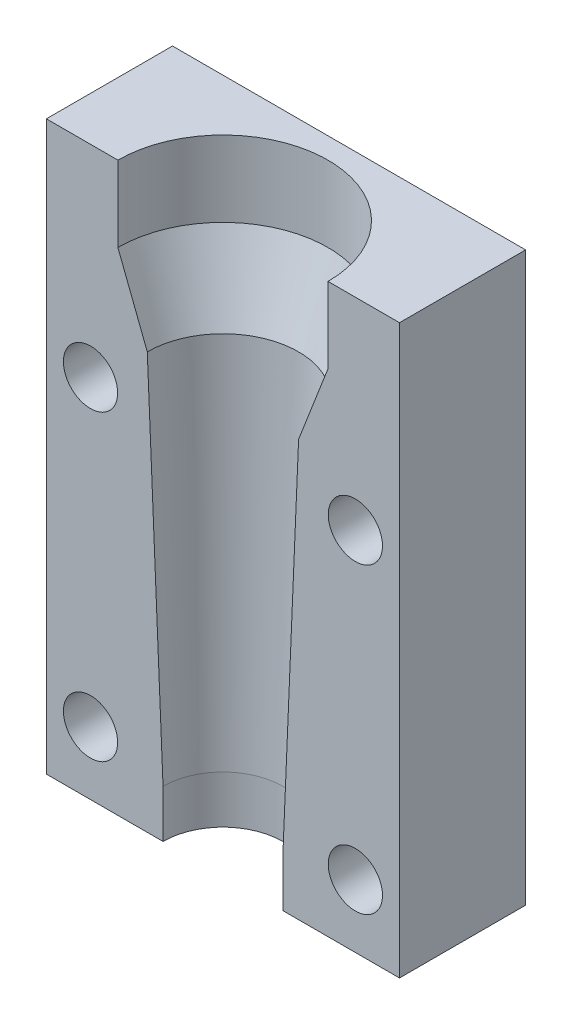
ISO-10303-21;
HEADER;
FILE_DESCRIPTION(('STEP AP214'),'2;1');
FILE_NAME('part.step','',(''),(''),'','','');
FILE_SCHEMA(('AUTOMOTIVE_DESIGN { 1 0 10303 214 1 1 1 1 }'));
ENDSEC;
DATA;
#1=APPLICATION_CONTEXT('core data for automotive mechanical design processes');
#2=APPLICATION_PROTOCOL_DEFINITION('international standard','automotive_design',2000,#1);
#3=PRODUCT_CONTEXT('',#1,'mechanical');
#4=PRODUCT('Part','Part','',(#3));
#5=PRODUCT_RELATED_PRODUCT_CATEGORY('part','',(#4));
#6=PRODUCT_DEFINITION_FORMATION('','',#4);
#7=PRODUCT_DEFINITION_CONTEXT('part definition',#1,'design');
#8=PRODUCT_DEFINITION('design','',#6,#7);
#9=PRODUCT_DEFINITION_SHAPE('','',#8);
#10=(LENGTH_UNIT() NAMED_UNIT(*) SI_UNIT(.MILLI.,.METRE.));
#11=(NAMED_UNIT(*) PLANE_ANGLE_UNIT() SI_UNIT($,.RADIAN.));
#12=(NAMED_UNIT(*) SI_UNIT($,.STERADIAN.) SOLID_ANGLE_UNIT());
#13=UNCERTAINTY_MEASURE_WITH_UNIT(LENGTH_MEASURE(1.E-05),#10,'distance_accuracy_value','');
#14=(GEOMETRIC_REPRESENTATION_CONTEXT(3) GLOBAL_UNCERTAINTY_ASSIGNED_CONTEXT((#13)) GLOBAL_UNIT_ASSIGNED_CONTEXT((#10,
#11,#12)) REPRESENTATION_CONTEXT('',''));
#15=CARTESIAN_POINT('',(0.,0.,0.));
#16=DIRECTION('',(0.,0.,1.));
#17=DIRECTION('',(1.,0.,0.));
#18=AXIS2_PLACEMENT_3D('',#15,#16,#17);
#19=CARTESIAN_POINT('',(0.,0.,10.));
#20=DIRECTION('',(0.,0.,1.));
#21=DIRECTION('',(1.,0.,0.));
#22=AXIS2_PLACEMENT_3D('',#19,#20,#21);
#23=PLANE('',#22);
#24=CARTESIAN_POINT('',(-10.5,-17.5,10.));
#25=DIRECTION('',(0.,0.,1.));
#26=DIRECTION('',(1.,0.,0.));
#27=AXIS2_PLACEMENT_3D('',#24,#25,#26);
#28=CIRCLE('',#27,2.15);
#29=CARTESIAN_POINT('',(-8.35,-17.5,10.));
#30=VERTEX_POINT('',#29);
#31=EDGE_CURVE('E219',#30,#30,#28,.T.);
#32=ORIENTED_EDGE('',*,*,#31,.F.);
#33=EDGE_LOOP('',(#32));
#34=FACE_BOUND('',#33,.T.);
#35=CARTESIAN_POINT('',(-10.5,6.5,10.));
#36=DIRECTION('',(0.,0.,1.));
#37=DIRECTION('',(1.,0.,0.));
#38=AXIS2_PLACEMENT_3D('',#35,#36,#37);
#39=CIRCLE('',#38,2.15);
#40=CARTESIAN_POINT('',(-8.35,6.5,10.));
#41=VERTEX_POINT('',#40);
#42=EDGE_CURVE('E222',#41,#41,#39,.T.);
#43=ORIENTED_EDGE('',*,*,#42,.F.);
#44=EDGE_LOOP('',(#43));
#45=FACE_BOUND('',#44,.T.);
#46=DIRECTION('',(0.,-1.,0.));
#47=VECTOR('',#46,1.);
#48=CARTESIAN_POINT('',(-8.33,0.,10.));
#49=LINE('',#48,#47);
#50=CARTESIAN_POINT('',(-8.33,22.5,10.));
#51=VERTEX_POINT('',#50);
#52=CARTESIAN_POINT('',(-8.33,16.5,10.));
#53=VERTEX_POINT('',#52);
#54=EDGE_CURVE('E11',#51,#53,#49,.T.);
#55=ORIENTED_EDGE('',*,*,#54,.F.);
#56=DIRECTION('',(-1.,0.,0.));
#57=VECTOR('',#56,1.);
#58=CARTESIAN_POINT('',(-14.,22.5,10.));
#59=LINE('',#58,#57);
#60=CARTESIAN_POINT('',(-14.,22.5,10.));
#61=VERTEX_POINT('',#60);
#62=EDGE_CURVE('E182',#51,#61,#59,.T.);
#63=ORIENTED_EDGE('',*,*,#62,.T.);
#64=DIRECTION('',(0.,-1.,0.));
#65=VECTOR('',#64,1.);
#66=CARTESIAN_POINT('',(-14.,22.5,10.));
#67=LINE('',#66,#65);
#68=CARTESIAN_POINT('',(-14.,-22.5,10.));
#69=VERTEX_POINT('',#68);
#70=EDGE_CURVE('E132',#61,#69,#67,.T.);
#71=ORIENTED_EDGE('',*,*,#70,.T.);
#72=DIRECTION('',(1.,0.,0.));
#73=VECTOR('',#72,1.);
#74=CARTESIAN_POINT('',(-14.,-22.5,10.));
#75=LINE('',#74,#73);
#76=CARTESIAN_POINT('',(-4.75,-22.5,10.));
#77=VERTEX_POINT('',#76);
#78=EDGE_CURVE('E127',#69,#77,#75,.T.);
#79=ORIENTED_EDGE('',*,*,#78,.T.);
#80=DIRECTION('',(0.,-1.,0.));
#81=VECTOR('',#80,1.);
#82=CARTESIAN_POINT('',(-4.75,0.,10.));
#83=LINE('',#82,#81);
#84=CARTESIAN_POINT('',(-4.75,-18.71,10.));
#85=VERTEX_POINT('',#84);
#86=EDGE_CURVE('E115',#85,#77,#83,.T.);
#87=ORIENTED_EDGE('',*,*,#86,.F.);
#88=DIRECTION('',(0.0427544338898444,-0.999085611137884,0.));
#89=VECTOR('',#88,1.);
#90=CARTESIAN_POINT('',(0.,-129.708,10.));
#91=LINE('',#90,#89);
#92=CARTESIAN_POINT('',(-6.,10.5,10.));
#93=VERTEX_POINT('',#92);
#94=EDGE_CURVE('E122',#93,#85,#91,.T.);
#95=ORIENTED_EDGE('',*,*,#94,.F.);
#96=DIRECTION('',(0.361996373599852,-0.932179502832237,0.));
#97=VECTOR('',#96,1.);
#98=CARTESIAN_POINT('',(0.,-4.95064377682404,10.));
#99=LINE('',#98,#97);
#100=EDGE_CURVE('E43',#53,#93,#99,.T.);
#101=ORIENTED_EDGE('',*,*,#100,.F.);
#102=EDGE_LOOP('',(#55,#63,#71,#79,#87,#95,#101));
#103=FACE_BOUND('',#102,.T.);
#104=ADVANCED_FACE('F35',(#34,#45,#103),#23,.T.);
#105=CARTESIAN_POINT('',(14.,22.5,10.));
#106=DIRECTION('',(-1.,0.,0.));
#107=DIRECTION('',(0.,-1.,0.));
#108=AXIS2_PLACEMENT_3D('',#105,#106,#107);
#109=PLANE('',#108);
#110=DIRECTION('',(0.,1.,0.));
#111=VECTOR('',#110,1.);
#112=CARTESIAN_POINT('',(14.,22.5,0.));
#113=LINE('',#112,#111);
#114=CARTESIAN_POINT('',(14.,-22.5,0.));
#115=VERTEX_POINT('',#114);
#116=CARTESIAN_POINT('',(14.,22.5,0.));
#117=VERTEX_POINT('',#116);
#118=EDGE_CURVE('E141',#115,#117,#113,.T.);
#119=ORIENTED_EDGE('',*,*,#118,.T.);
#120=DIRECTION('',(0.,0.,-1.));
#121=VECTOR('',#120,1.);
#122=CARTESIAN_POINT('',(14.,22.5,10.));
#123=LINE('',#122,#121);
#124=CARTESIAN_POINT('',(14.,22.5,10.));
#125=VERTEX_POINT('',#124);
#126=EDGE_CURVE('E155',#125,#117,#123,.T.);
#127=ORIENTED_EDGE('',*,*,#126,.F.);
#128=DIRECTION('',(0.,1.,0.));
#129=VECTOR('',#128,1.);
#130=CARTESIAN_POINT('',(14.,22.5,10.));
#131=LINE('',#130,#129);
#132=CARTESIAN_POINT('',(14.,-22.5,10.));
#133=VERTEX_POINT('',#132);
#134=EDGE_CURVE('E149',#133,#125,#131,.T.);
#135=ORIENTED_EDGE('',*,*,#134,.F.);
#136=DIRECTION('',(0.,0.,-1.));
#137=VECTOR('',#136,1.);
#138=CARTESIAN_POINT('',(14.,-22.5,10.));
#139=LINE('',#138,#137);
#140=EDGE_CURVE('E134',#133,#115,#139,.T.);
#141=ORIENTED_EDGE('',*,*,#140,.T.);
#142=EDGE_LOOP('',(#119,#127,#135,#141));
#143=FACE_BOUND('',#142,.T.);
#144=ADVANCED_FACE('F37',(#143),#109,.F.);
#145=CARTESIAN_POINT('',(-14.,22.5,10.));
#146=DIRECTION('',(0.,-1.,0.));
#147=DIRECTION('',(0.,0.,-1.));
#148=AXIS2_PLACEMENT_3D('',#145,#146,#147);
#149=PLANE('',#148);
#150=ORIENTED_EDGE('',*,*,#62,.F.);
#151=CARTESIAN_POINT('',(0.,22.5,10.));
#152=DIRECTION('',(0.,-1.,0.));
#153=DIRECTION('',(0.,0.,-1.));
#154=AXIS2_PLACEMENT_3D('',#151,#152,#153);
#155=CIRCLE('',#154,8.33);
#156=CARTESIAN_POINT('',(8.33,22.5,10.));
#157=VERTEX_POINT('',#156);
#158=EDGE_CURVE('E145',#51,#157,#155,.T.);
#159=ORIENTED_EDGE('',*,*,#158,.T.);
#160=EDGE_CURVE('E88',#125,#157,#59,.T.);
#161=ORIENTED_EDGE('',*,*,#160,.F.);
#162=ORIENTED_EDGE('',*,*,#126,.T.);
#163=DIRECTION('',(-1.,0.,0.));
#164=VECTOR('',#163,1.);
#165=CARTESIAN_POINT('',(-14.,22.5,0.));
#166=LINE('',#165,#164);
#167=CARTESIAN_POINT('',(-14.,22.5,0.));
#168=VERTEX_POINT('',#167);
#169=EDGE_CURVE('E144',#117,#168,#166,.T.);
#170=ORIENTED_EDGE('',*,*,#169,.T.);
#171=DIRECTION('',(0.,0.,-1.));
#172=VECTOR('',#171,1.);
#173=CARTESIAN_POINT('',(-14.,22.5,10.));
#174=LINE('',#173,#172);
#175=EDGE_CURVE('E152',#61,#168,#174,.T.);
#176=ORIENTED_EDGE('',*,*,#175,.F.);
#177=EDGE_LOOP('',(#150,#159,#161,#162,#170,#176));
#178=FACE_BOUND('',#177,.T.);
#179=ADVANCED_FACE('F186',(#178),#149,.F.);
#180=CARTESIAN_POINT('',(-14.,22.5,10.));
#181=DIRECTION('',(1.,0.,0.));
#182=DIRECTION('',(0.,1.,0.));
#183=AXIS2_PLACEMENT_3D('',#180,#181,#182);
#184=PLANE('',#183);
#185=DIRECTION('',(0.,-1.,0.));
#186=VECTOR('',#185,1.);
#187=CARTESIAN_POINT('',(-14.,22.5,0.));
#188=LINE('',#187,#186);
#189=CARTESIAN_POINT('',(-14.,-22.5,0.));
#190=VERTEX_POINT('',#189);
#191=EDGE_CURVE('E147',#168,#190,#188,.T.);
#192=ORIENTED_EDGE('',*,*,#191,.T.);
#193=DIRECTION('',(0.,0.,-1.));
#194=VECTOR('',#193,1.);
#195=CARTESIAN_POINT('',(-14.,-22.5,10.));
#196=LINE('',#195,#194);
#197=EDGE_CURVE('E136',#69,#190,#196,.T.);
#198=ORIENTED_EDGE('',*,*,#197,.F.);
#199=ORIENTED_EDGE('',*,*,#70,.F.);
#200=ORIENTED_EDGE('',*,*,#175,.T.);
#201=EDGE_LOOP('',(#192,#198,#199,#200));
#202=FACE_BOUND('',#201,.T.);
#203=ADVANCED_FACE('F189',(#202),#184,.F.);
#204=CARTESIAN_POINT('',(-14.,-22.5,10.));
#205=DIRECTION('',(0.,1.,0.));
#206=DIRECTION('',(0.,0.,1.));
#207=AXIS2_PLACEMENT_3D('',#204,#205,#206);
#208=PLANE('',#207);
#209=CARTESIAN_POINT('',(4.75,-22.5,10.));
#210=VERTEX_POINT('',#209);
#211=EDGE_CURVE('E58',#210,#133,#75,.T.);
#212=ORIENTED_EDGE('',*,*,#211,.F.);
#213=CARTESIAN_POINT('',(0.,-22.5,10.));
#214=DIRECTION('',(0.,-1.,0.));
#215=DIRECTION('',(0.,0.,-1.));
#216=AXIS2_PLACEMENT_3D('',#213,#214,#215);
#217=CIRCLE('',#216,4.75);
#218=EDGE_CURVE('E50',#77,#210,#217,.T.);
#219=ORIENTED_EDGE('',*,*,#218,.F.);
#220=ORIENTED_EDGE('',*,*,#78,.F.);
#221=ORIENTED_EDGE('',*,*,#197,.T.);
#222=DIRECTION('',(1.,0.,0.));
#223=VECTOR('',#222,1.);
#224=CARTESIAN_POINT('',(-14.,-22.5,0.));
#225=LINE('',#224,#223);
#226=EDGE_CURVE('E80',#190,#115,#225,.T.);
#227=ORIENTED_EDGE('',*,*,#226,.T.);
#228=ORIENTED_EDGE('',*,*,#140,.F.);
#229=EDGE_LOOP('',(#212,#219,#220,#221,#227,#228));
#230=FACE_BOUND('',#229,.T.);
#231=ADVANCED_FACE('F126',(#230),#208,.F.);
#232=CARTESIAN_POINT('',(10.5,6.5,10.));
#233=DIRECTION('',(0.,0.,1.));
#234=DIRECTION('',(1.,0.,0.));
#235=AXIS2_PLACEMENT_3D('',#232,#233,#234);
#236=CIRCLE('',#235,2.15);
#237=CARTESIAN_POINT('',(12.65,6.5,10.));
#238=VERTEX_POINT('',#237);
#239=EDGE_CURVE('E231',#238,#238,#236,.T.);
#240=ORIENTED_EDGE('',*,*,#239,.F.);
#241=EDGE_LOOP('',(#240));
#242=FACE_BOUND('',#241,.T.);
#243=CARTESIAN_POINT('',(10.5,-17.5,10.));
#244=DIRECTION('',(0.,0.,1.));
#245=DIRECTION('',(1.,0.,0.));
#246=AXIS2_PLACEMENT_3D('',#243,#244,#245);
#247=CIRCLE('',#246,2.15);
#248=CARTESIAN_POINT('',(12.65,-17.5,10.));
#249=VERTEX_POINT('',#248);
#250=EDGE_CURVE('E239',#249,#249,#247,.T.);
#251=ORIENTED_EDGE('',*,*,#250,.F.);
#252=EDGE_LOOP('',(#251));
#253=FACE_BOUND('',#252,.T.);
#254=DIRECTION('',(0.,-1.,0.));
#255=VECTOR('',#254,1.);
#256=CARTESIAN_POINT('',(8.33,0.,10.));
#257=LINE('',#256,#255);
#258=CARTESIAN_POINT('',(8.33,16.5,10.));
#259=VERTEX_POINT('',#258);
#260=EDGE_CURVE('E123',#259,#157,#257,.F.);
#261=ORIENTED_EDGE('',*,*,#260,.F.);
#262=DIRECTION('',(0.361996373599852,0.932179502832237,0.));
#263=VECTOR('',#262,1.);
#264=CARTESIAN_POINT('',(0.,-4.95064377682404,10.));
#265=LINE('',#264,#263);
#266=CARTESIAN_POINT('',(6.,10.5,10.));
#267=VERTEX_POINT('',#266);
#268=EDGE_CURVE('E161',#267,#259,#265,.T.);
#269=ORIENTED_EDGE('',*,*,#268,.F.);
#270=DIRECTION('',(0.0427544338898444,0.999085611137884,0.));
#271=VECTOR('',#270,1.);
#272=CARTESIAN_POINT('',(0.,-129.708,10.));
#273=LINE('',#272,#271);
#274=CARTESIAN_POINT('',(4.75,-18.71,10.));
#275=VERTEX_POINT('',#274);
#276=EDGE_CURVE('E159',#275,#267,#273,.T.);
#277=ORIENTED_EDGE('',*,*,#276,.F.);
#278=DIRECTION('',(0.,-1.,0.));
#279=VECTOR('',#278,1.);
#280=CARTESIAN_POINT('',(4.75,0.,10.));
#281=LINE('',#280,#279);
#282=EDGE_CURVE('E157',#210,#275,#281,.F.);
#283=ORIENTED_EDGE('',*,*,#282,.F.);
#284=ORIENTED_EDGE('',*,*,#211,.T.);
#285=ORIENTED_EDGE('',*,*,#134,.T.);
#286=ORIENTED_EDGE('',*,*,#160,.T.);
#287=EDGE_LOOP('',(#261,#269,#277,#283,#284,#285,#286));
#288=FACE_BOUND('',#287,.T.);
#289=ADVANCED_FACE('F196',(#242,#253,#288),#23,.T.);
#290=CARTESIAN_POINT('',(0.,0.,0.));
#291=DIRECTION('',(0.,0.,1.));
#292=DIRECTION('',(1.,0.,0.));
#293=AXIS2_PLACEMENT_3D('',#290,#291,#292);
#294=PLANE('',#293);
#295=CARTESIAN_POINT('',(10.,12.5,0.));
#296=DIRECTION('',(0.,0.,-1.));
#297=DIRECTION('',(-1.,0.,0.));
#298=AXIS2_PLACEMENT_3D('',#295,#296,#297);
#299=CIRCLE('',#298,2.75);
#300=CARTESIAN_POINT('',(7.25,12.5,0.));
#301=VERTEX_POINT('',#300);
#302=EDGE_CURVE('E251',#301,#301,#299,.T.);
#303=ORIENTED_EDGE('',*,*,#302,.F.);
#304=EDGE_LOOP('',(#303));
#305=FACE_BOUND('',#304,.T.);
#306=CARTESIAN_POINT('',(-10.,12.5,0.));
#307=DIRECTION('',(0.,0.,-1.));
#308=DIRECTION('',(-1.,0.,0.));
#309=AXIS2_PLACEMENT_3D('',#306,#307,#308);
#310=CIRCLE('',#309,2.75);
#311=CARTESIAN_POINT('',(-12.75,12.5,0.));
#312=VERTEX_POINT('',#311);
#313=EDGE_CURVE('E245',#312,#312,#310,.T.);
#314=ORIENTED_EDGE('',*,*,#313,.F.);
#315=EDGE_LOOP('',(#314));
#316=FACE_BOUND('',#315,.T.);
#317=ORIENTED_EDGE('',*,*,#118,.F.);
#318=ORIENTED_EDGE('',*,*,#226,.F.);
#319=ORIENTED_EDGE('',*,*,#191,.F.);
#320=ORIENTED_EDGE('',*,*,#169,.F.);
#321=EDGE_LOOP('',(#317,#318,#319,#320));
#322=FACE_BOUND('',#321,.T.);
#323=ADVANCED_FACE('F192',(#305,#316,#322),#294,.F.);
#324=CARTESIAN_POINT('',(0.,0.,10.));
#325=DIRECTION('',(0.,-1.,0.));
#326=DIRECTION('',(0.,0.,-1.));
#327=AXIS2_PLACEMENT_3D('',#324,#325,#326);
#328=CYLINDRICAL_SURFACE('',#327,8.33);
#329=ORIENTED_EDGE('',*,*,#54,.T.);
#330=CARTESIAN_POINT('',(0.,16.5,10.));
#331=DIRECTION('',(0.,-1.,0.));
#332=DIRECTION('',(0.,0.,-1.));
#333=AXIS2_PLACEMENT_3D('',#330,#331,#332);
#334=CIRCLE('',#333,8.33);
#335=EDGE_CURVE('E173',#53,#259,#334,.T.);
#336=ORIENTED_EDGE('',*,*,#335,.T.);
#337=ORIENTED_EDGE('',*,*,#260,.T.);
#338=ORIENTED_EDGE('',*,*,#158,.F.);
#339=EDGE_LOOP('',(#329,#336,#337,#338));
#340=FACE_BOUND('',#339,.T.);
#341=ADVANCED_FACE('F204',(#340),#328,.F.);
#342=CARTESIAN_POINT('',(0.,10.5,10.));
#343=DIRECTION('',(0.,1.,0.));
#344=DIRECTION('',(0.,0.,1.));
#345=AXIS2_PLACEMENT_3D('',#342,#343,#344);
#346=CONICAL_SURFACE('',#345,6.,0.370408624543169);
#347=ORIENTED_EDGE('',*,*,#268,.T.);
#348=ORIENTED_EDGE('',*,*,#335,.F.);
#349=ORIENTED_EDGE('',*,*,#100,.T.);
#350=CARTESIAN_POINT('',(0.,10.5,10.));
#351=DIRECTION('',(0.,-1.,0.));
#352=DIRECTION('',(0.,0.,-1.));
#353=AXIS2_PLACEMENT_3D('',#350,#351,#352);
#354=CIRCLE('',#353,6.);
#355=EDGE_CURVE('E170',#93,#267,#354,.T.);
#356=ORIENTED_EDGE('',*,*,#355,.T.);
#357=EDGE_LOOP('',(#347,#348,#349,#356));
#358=FACE_BOUND('',#357,.T.);
#359=ADVANCED_FACE('F169',(#358),#346,.F.);
#360=CARTESIAN_POINT('',(0.,-18.71,10.));
#361=DIRECTION('',(0.,1.,0.));
#362=DIRECTION('',(0.,0.,1.));
#363=AXIS2_PLACEMENT_3D('',#360,#361,#362);
#364=CONICAL_SURFACE('',#363,4.75,0.0427674700507354);
#365=ORIENTED_EDGE('',*,*,#276,.T.);
#366=ORIENTED_EDGE('',*,*,#355,.F.);
#367=ORIENTED_EDGE('',*,*,#94,.T.);
#368=CARTESIAN_POINT('',(0.,-18.71,10.));
#369=DIRECTION('',(0.,-1.,0.));
#370=DIRECTION('',(0.,0.,-1.));
#371=AXIS2_PLACEMENT_3D('',#368,#369,#370);
#372=CIRCLE('',#371,4.75);
#373=EDGE_CURVE('E118',#85,#275,#372,.T.);
#374=ORIENTED_EDGE('',*,*,#373,.T.);
#375=EDGE_LOOP('',(#365,#366,#367,#374));
#376=FACE_BOUND('',#375,.T.);
#377=ADVANCED_FACE('F175',(#376),#364,.F.);
#378=CARTESIAN_POINT('',(0.,0.,10.));
#379=DIRECTION('',(0.,-1.,0.));
#380=DIRECTION('',(0.,0.,-1.));
#381=AXIS2_PLACEMENT_3D('',#378,#379,#380);
#382=CYLINDRICAL_SURFACE('',#381,4.75);
#383=ORIENTED_EDGE('',*,*,#86,.T.);
#384=ORIENTED_EDGE('',*,*,#218,.T.);
#385=ORIENTED_EDGE('',*,*,#282,.T.);
#386=ORIENTED_EDGE('',*,*,#373,.F.);
#387=EDGE_LOOP('',(#383,#384,#385,#386));
#388=FACE_BOUND('',#387,.T.);
#389=ADVANCED_FACE('F116',(#388),#382,.F.);
#390=CARTESIAN_POINT('',(10.5,-17.5,4.));
#391=DIRECTION('',(0.,0.,1.));
#392=DIRECTION('',(1.,0.,0.));
#393=AXIS2_PLACEMENT_3D('',#390,#391,#392);
#394=CYLINDRICAL_SURFACE('',#393,2.15);
#395=CARTESIAN_POINT('',(10.5,-17.5,4.));
#396=DIRECTION('',(0.,0.,1.));
#397=DIRECTION('',(1.,0.,0.));
#398=AXIS2_PLACEMENT_3D('',#395,#396,#397);
#399=CIRCLE('',#398,2.15);
#400=CARTESIAN_POINT('',(12.65,-17.5,4.));
#401=VERTEX_POINT('',#400);
#402=EDGE_CURVE('E235',#401,#401,#399,.T.);
#403=ORIENTED_EDGE('',*,*,#402,.F.);
#404=EDGE_LOOP('',(#403));
#405=FACE_BOUND('',#404,.T.);
#406=ORIENTED_EDGE('',*,*,#250,.T.);
#407=EDGE_LOOP('',(#406));
#408=FACE_BOUND('',#407,.T.);
#409=ADVANCED_FACE('F288',(#405,#408),#394,.F.);
#410=CARTESIAN_POINT('',(10.5,-17.5,4.));
#411=DIRECTION('',(0.,0.,1.));
#412=DIRECTION('',(1.,0.,0.));
#413=AXIS2_PLACEMENT_3D('',#410,#411,#412);
#414=PLANE('',#413);
#415=ORIENTED_EDGE('',*,*,#402,.T.);
#416=EDGE_LOOP('',(#415));
#417=FACE_BOUND('',#416,.T.);
#418=ADVANCED_FACE('F284',(#417),#414,.T.);
#419=CARTESIAN_POINT('',(10.5,6.5,4.));
#420=DIRECTION('',(0.,0.,1.));
#421=DIRECTION('',(1.,0.,0.));
#422=AXIS2_PLACEMENT_3D('',#419,#420,#421);
#423=CYLINDRICAL_SURFACE('',#422,2.15);
#424=CARTESIAN_POINT('',(10.5,6.5,4.));
#425=DIRECTION('',(0.,0.,1.));
#426=DIRECTION('',(1.,0.,0.));
#427=AXIS2_PLACEMENT_3D('',#424,#425,#426);
#428=CIRCLE('',#427,2.15);
#429=CARTESIAN_POINT('',(12.65,6.5,4.));
#430=VERTEX_POINT('',#429);
#431=EDGE_CURVE('E234',#430,#430,#428,.T.);
#432=ORIENTED_EDGE('',*,*,#431,.F.);
#433=EDGE_LOOP('',(#432));
#434=FACE_BOUND('',#433,.T.);
#435=ORIENTED_EDGE('',*,*,#239,.T.);
#436=EDGE_LOOP('',(#435));
#437=FACE_BOUND('',#436,.T.);
#438=ADVANCED_FACE('F287',(#434,#437),#423,.F.);
#439=CARTESIAN_POINT('',(10.5,6.5,4.));
#440=DIRECTION('',(0.,0.,1.));
#441=DIRECTION('',(1.,0.,0.));
#442=AXIS2_PLACEMENT_3D('',#439,#440,#441);
#443=PLANE('',#442);
#444=ORIENTED_EDGE('',*,*,#431,.T.);
#445=EDGE_LOOP('',(#444));
#446=FACE_BOUND('',#445,.T.);
#447=ADVANCED_FACE('F297',(#446),#443,.T.);
#448=CARTESIAN_POINT('',(-10.5,6.5,4.));
#449=DIRECTION('',(0.,0.,1.));
#450=DIRECTION('',(1.,0.,0.));
#451=AXIS2_PLACEMENT_3D('',#448,#449,#450);
#452=CYLINDRICAL_SURFACE('',#451,2.15);
#453=CARTESIAN_POINT('',(-10.5,6.5,4.));
#454=DIRECTION('',(0.,0.,1.));
#455=DIRECTION('',(1.,0.,0.));
#456=AXIS2_PLACEMENT_3D('',#453,#454,#455);
#457=CIRCLE('',#456,2.15);
#458=CARTESIAN_POINT('',(-8.35,6.5,4.));
#459=VERTEX_POINT('',#458);
#460=EDGE_CURVE('E128',#459,#459,#457,.T.);
#461=ORIENTED_EDGE('',*,*,#460,.F.);
#462=EDGE_LOOP('',(#461));
#463=FACE_BOUND('',#462,.T.);
#464=ORIENTED_EDGE('',*,*,#42,.T.);
#465=EDGE_LOOP('',(#464));
#466=FACE_BOUND('',#465,.T.);
#467=ADVANCED_FACE('F300',(#463,#466),#452,.F.);
#468=CARTESIAN_POINT('',(-10.5,6.5,4.));
#469=DIRECTION('',(0.,0.,1.));
#470=DIRECTION('',(1.,0.,0.));
#471=AXIS2_PLACEMENT_3D('',#468,#469,#470);
#472=PLANE('',#471);
#473=ORIENTED_EDGE('',*,*,#460,.T.);
#474=EDGE_LOOP('',(#473));
#475=FACE_BOUND('',#474,.T.);
#476=ADVANCED_FACE('F295',(#475),#472,.T.);
#477=CARTESIAN_POINT('',(-10.5,-17.5,4.));
#478=DIRECTION('',(0.,0.,1.));
#479=DIRECTION('',(1.,0.,0.));
#480=AXIS2_PLACEMENT_3D('',#477,#478,#479);
#481=CYLINDRICAL_SURFACE('',#480,2.15);
#482=CARTESIAN_POINT('',(-10.5,-17.5,4.));
#483=DIRECTION('',(0.,0.,1.));
#484=DIRECTION('',(1.,0.,0.));
#485=AXIS2_PLACEMENT_3D('',#482,#483,#484);
#486=CIRCLE('',#485,2.15);
#487=CARTESIAN_POINT('',(-8.35,-17.5,4.));
#488=VERTEX_POINT('',#487);
#489=EDGE_CURVE('E224',#488,#488,#486,.T.);
#490=ORIENTED_EDGE('',*,*,#489,.F.);
#491=EDGE_LOOP('',(#490));
#492=FACE_BOUND('',#491,.T.);
#493=ORIENTED_EDGE('',*,*,#31,.T.);
#494=EDGE_LOOP('',(#493));
#495=FACE_BOUND('',#494,.T.);
#496=ADVANCED_FACE('F279',(#492,#495),#481,.F.);
#497=CARTESIAN_POINT('',(-10.5,-17.5,4.));
#498=DIRECTION('',(0.,0.,1.));
#499=DIRECTION('',(1.,0.,0.));
#500=AXIS2_PLACEMENT_3D('',#497,#498,#499);
#501=PLANE('',#500);
#502=ORIENTED_EDGE('',*,*,#489,.T.);
#503=EDGE_LOOP('',(#502));
#504=FACE_BOUND('',#503,.T.);
#505=ADVANCED_FACE('F270',(#504),#501,.T.);
#506=CARTESIAN_POINT('',(-10.,12.5,6.));
#507=DIRECTION('',(0.,0.,-1.));
#508=DIRECTION('',(-1.,0.,0.));
#509=AXIS2_PLACEMENT_3D('',#506,#507,#508);
#510=CYLINDRICAL_SURFACE('',#509,2.75);
#511=CARTESIAN_POINT('',(-10.,12.5,6.));
#512=DIRECTION('',(0.,0.,-1.));
#513=DIRECTION('',(-1.,0.,0.));
#514=AXIS2_PLACEMENT_3D('',#511,#512,#513);
#515=CIRCLE('',#514,2.75);
#516=CARTESIAN_POINT('',(-12.75,12.5,6.));
#517=VERTEX_POINT('',#516);
#518=EDGE_CURVE('E248',#517,#517,#515,.T.);
#519=ORIENTED_EDGE('',*,*,#518,.F.);
#520=EDGE_LOOP('',(#519));
#521=FACE_BOUND('',#520,.T.);
#522=ORIENTED_EDGE('',*,*,#313,.T.);
#523=EDGE_LOOP('',(#522));
#524=FACE_BOUND('',#523,.T.);
#525=ADVANCED_FACE('F268',(#521,#524),#510,.F.);
#526=CARTESIAN_POINT('',(-10.,12.5,6.));
#527=DIRECTION('',(0.,0.,-1.));
#528=DIRECTION('',(-1.,0.,0.));
#529=AXIS2_PLACEMENT_3D('',#526,#527,#528);
#530=PLANE('',#529);
#531=ORIENTED_EDGE('',*,*,#518,.T.);
#532=EDGE_LOOP('',(#531));
#533=FACE_BOUND('',#532,.T.);
#534=ADVANCED_FACE('F262',(#533),#530,.T.);
#535=CARTESIAN_POINT('',(10.,12.5,6.));
#536=DIRECTION('',(0.,0.,-1.));
#537=DIRECTION('',(-1.,0.,0.));
#538=AXIS2_PLACEMENT_3D('',#535,#536,#537);
#539=CYLINDRICAL_SURFACE('',#538,2.75);
#540=CARTESIAN_POINT('',(10.,12.5,6.));
#541=DIRECTION('',(0.,0.,-1.));
#542=DIRECTION('',(-1.,0.,0.));
#543=AXIS2_PLACEMENT_3D('',#540,#541,#542);
#544=CIRCLE('',#543,2.75);
#545=CARTESIAN_POINT('',(7.25,12.5,6.));
#546=VERTEX_POINT('',#545);
#547=EDGE_CURVE('E242',#546,#546,#544,.T.);
#548=ORIENTED_EDGE('',*,*,#547,.F.);
#549=EDGE_LOOP('',(#548));
#550=FACE_BOUND('',#549,.T.);
#551=ORIENTED_EDGE('',*,*,#302,.T.);
#552=EDGE_LOOP('',(#551));
#553=FACE_BOUND('',#552,.T.);
#554=ADVANCED_FACE('F259',(#550,#553),#539,.F.);
#555=CARTESIAN_POINT('',(10.,12.5,6.));
#556=DIRECTION('',(0.,0.,-1.));
#557=DIRECTION('',(-1.,0.,0.));
#558=AXIS2_PLACEMENT_3D('',#555,#556,#557);
#559=PLANE('',#558);
#560=ORIENTED_EDGE('',*,*,#547,.T.);
#561=EDGE_LOOP('',(#560));
#562=FACE_BOUND('',#561,.T.);
#563=ADVANCED_FACE('F257',(#562),#559,.T.);
#564=CLOSED_SHELL('',(#104,#144,#179,#203,#231,#289,#323,#341,#359,#377,#389,#409,#418,#438,
#447,#467,#476,#496,#505,#525,#534,#554,#563));
#565=MANIFOLD_SOLID_BREP('B2',#564);
#566=ADVANCED_BREP_SHAPE_REPRESENTATION('',(#18,#565),#14);
#567=SHAPE_DEFINITION_REPRESENTATION(#9,#566);
ENDSEC;
END-ISO-10303-21;
